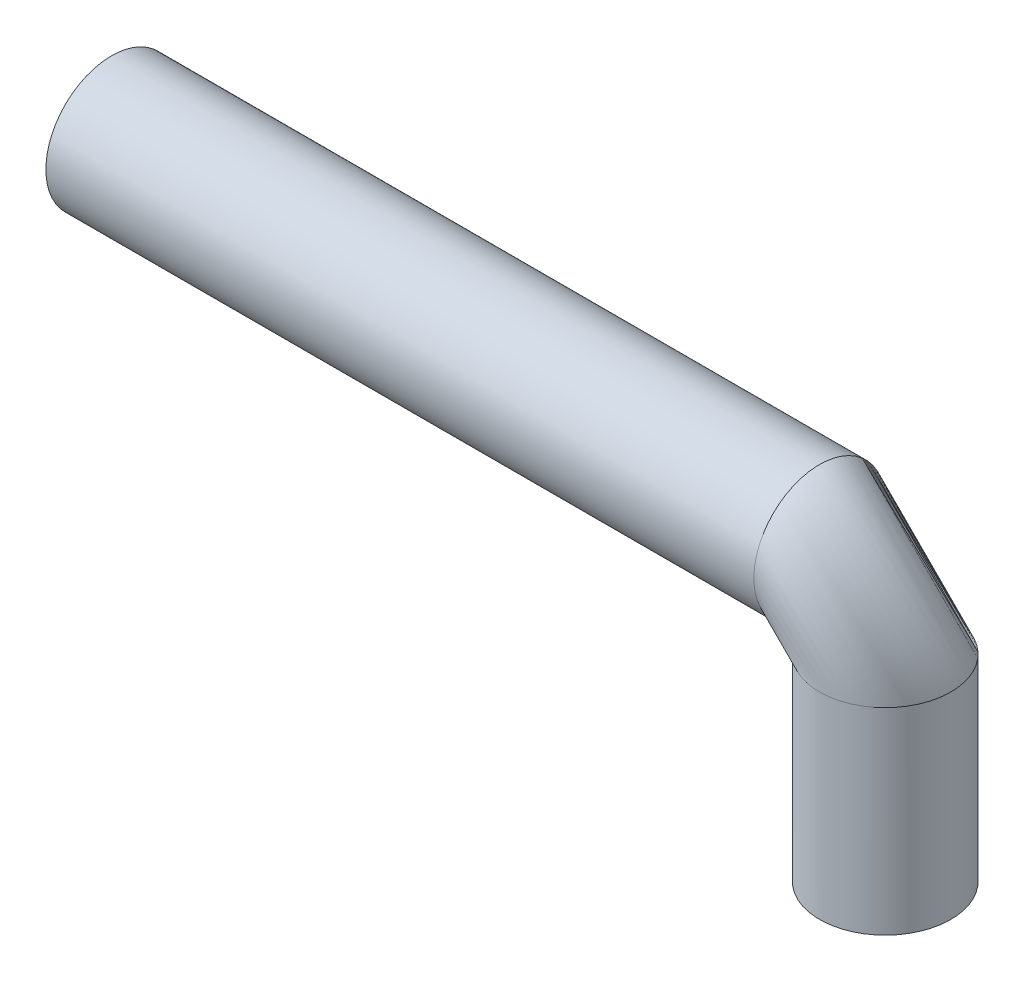
ISO-10303-21;
HEADER;
FILE_DESCRIPTION(('STEP AP214'),'2;1');
FILE_NAME('part.step','',(''),(''),'','','');
FILE_SCHEMA(('AUTOMOTIVE_DESIGN { 1 0 10303 214 1 1 1 1 }'));
ENDSEC;
DATA;
#1=APPLICATION_CONTEXT('core data for automotive mechanical design processes');
#2=APPLICATION_PROTOCOL_DEFINITION('international standard','automotive_design',2000,#1);
#3=PRODUCT_CONTEXT('',#1,'mechanical');
#4=PRODUCT('Part','Part','',(#3));
#5=PRODUCT_RELATED_PRODUCT_CATEGORY('part','',(#4));
#6=PRODUCT_DEFINITION_FORMATION('','',#4);
#7=PRODUCT_DEFINITION_CONTEXT('part definition',#1,'design');
#8=PRODUCT_DEFINITION('design','',#6,#7);
#9=PRODUCT_DEFINITION_SHAPE('','',#8);
#10=(LENGTH_UNIT() NAMED_UNIT(*) SI_UNIT(.MILLI.,.METRE.));
#11=(NAMED_UNIT(*) PLANE_ANGLE_UNIT() SI_UNIT($,.RADIAN.));
#12=(NAMED_UNIT(*) SI_UNIT($,.STERADIAN.) SOLID_ANGLE_UNIT());
#13=UNCERTAINTY_MEASURE_WITH_UNIT(LENGTH_MEASURE(1.E-05),#10,'distance_accuracy_value','');
#14=(GEOMETRIC_REPRESENTATION_CONTEXT(3) GLOBAL_UNCERTAINTY_ASSIGNED_CONTEXT((#13)) GLOBAL_UNIT_ASSIGNED_CONTEXT((#10,
#11,#12)) REPRESENTATION_CONTEXT('',''));
#15=CARTESIAN_POINT('',(0.,0.,0.));
#16=DIRECTION('',(0.,0.,1.));
#17=DIRECTION('',(1.,0.,0.));
#18=AXIS2_PLACEMENT_3D('',#15,#16,#17);
#19=CARTESIAN_POINT('',(0.,0.,0.));
#20=DIRECTION('',(1.,0.,0.));
#21=DIRECTION('',(0.,0.,-1.));
#22=AXIS2_PLACEMENT_3D('',#19,#20,#21);
#23=PLANE('',#22);
#24=CARTESIAN_POINT('',(0.,0.,0.));
#25=DIRECTION('',(1.,0.,0.));
#26=DIRECTION('',(0.,0.,-1.));
#27=AXIS2_PLACEMENT_3D('',#24,#25,#26);
#28=CIRCLE('',#27,1.5875);
#29=CARTESIAN_POINT('',(0.,0.,-1.5875));
#30=VERTEX_POINT('',#29);
#31=EDGE_CURVE('E49',#30,#30,#28,.T.);
#32=ORIENTED_EDGE('',*,*,#31,.F.);
#33=EDGE_LOOP('',(#32));
#34=FACE_BOUND('',#33,.T.);
#35=ADVANCED_FACE('F33',(#34),#23,.F.);
#36=CARTESIAN_POINT('',(18.70075,-6.35,0.));
#37=DIRECTION('',(0.,-1.,0.));
#38=DIRECTION('',(0.,0.,-1.));
#39=AXIS2_PLACEMENT_3D('',#36,#37,#38);
#40=PLANE('',#39);
#41=CARTESIAN_POINT('',(18.70075,-6.35,0.));
#42=DIRECTION('',(0.,-1.,0.));
#43=DIRECTION('',(0.,0.,-1.));
#44=AXIS2_PLACEMENT_3D('',#41,#42,#43);
#45=CIRCLE('',#44,1.5875);
#46=CARTESIAN_POINT('',(18.70075,-6.35,-1.5875));
#47=VERTEX_POINT('',#46);
#48=EDGE_CURVE('E11',#47,#47,#45,.T.);
#49=ORIENTED_EDGE('',*,*,#48,.T.);
#50=EDGE_LOOP('',(#49));
#51=FACE_BOUND('',#50,.T.);
#52=ADVANCED_FACE('F56',(#51),#40,.T.);
#53=CARTESIAN_POINT('',(0.,0.,0.));
#54=DIRECTION('',(1.,0.,0.));
#55=DIRECTION('',(0.,0.,-1.));
#56=AXIS2_PLACEMENT_3D('',#53,#54,#55);
#57=CYLINDRICAL_SURFACE('',#56,1.5875);
#58=CARTESIAN_POINT('',(17.11325,0.,0.));
#59=DIRECTION('',(1.,0.,0.));
#60=DIRECTION('',(0.,0.,-1.));
#61=AXIS2_PLACEMENT_3D('',#58,#59,#60);
#62=CIRCLE('',#61,1.5875);
#63=CARTESIAN_POINT('',(17.11325,-1.5875,0.));
#64=VERTEX_POINT('',#63);
#65=EDGE_CURVE('E43',#64,#64,#62,.T.);
#66=ORIENTED_EDGE('',*,*,#65,.F.);
#67=EDGE_LOOP('',(#66));
#68=FACE_BOUND('',#67,.T.);
#69=ORIENTED_EDGE('',*,*,#31,.T.);
#70=EDGE_LOOP('',(#69));
#71=FACE_BOUND('',#70,.T.);
#72=ADVANCED_FACE('F44',(#68,#71),#57,.T.);
#73=CARTESIAN_POINT('',(17.11325,-1.5875,0.));
#74=DIRECTION('',(0.,0.,-1.));
#75=DIRECTION('',(-1.,0.,0.));
#76=AXIS2_PLACEMENT_3D('',#73,#74,#75);
#77=TOROIDAL_SURFACE('',#76,1.5875,1.5875);
#78=CARTESIAN_POINT('',(18.70075,-1.58750000000001,0.));
#79=DIRECTION('',(0.,-1.,0.));
#80=DIRECTION('',(0.,0.,-1.));
#81=AXIS2_PLACEMENT_3D('',#78,#79,#80);
#82=CIRCLE('',#81,1.5875);
#83=EDGE_CURVE('E39',#64,#64,#82,.T.);
#84=ORIENTED_EDGE('',*,*,#83,.F.);
#85=ORIENTED_EDGE('',*,*,#65,.T.);
#86=EDGE_LOOP('',(#84,#85));
#87=FACE_BOUND('',#86,.T.);
#88=ADVANCED_FACE('F63',(#87),#77,.T.);
#89=CARTESIAN_POINT('',(18.70075,-1.58750000000001,0.));
#90=DIRECTION('',(0.,-1.,0.));
#91=DIRECTION('',(0.,0.,-1.));
#92=AXIS2_PLACEMENT_3D('',#89,#90,#91);
#93=CYLINDRICAL_SURFACE('',#92,1.5875);
#94=ORIENTED_EDGE('',*,*,#48,.F.);
#95=EDGE_LOOP('',(#94));
#96=FACE_BOUND('',#95,.T.);
#97=ORIENTED_EDGE('',*,*,#83,.T.);
#98=EDGE_LOOP('',(#97));
#99=FACE_BOUND('',#98,.T.);
#100=ADVANCED_FACE('F61',(#96,#99),#93,.T.);
#101=CLOSED_SHELL('',(#35,#52,#72,#88,#100));
#102=MANIFOLD_SOLID_BREP('B2',#101);
#103=ADVANCED_BREP_SHAPE_REPRESENTATION('',(#18,#102),#14);
#104=SHAPE_DEFINITION_REPRESENTATION(#9,#103);
ENDSEC;
END-ISO-10303-21;
